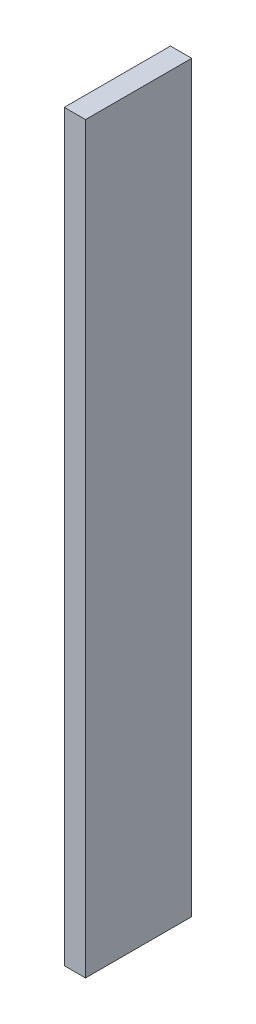
ISO-10303-21;
HEADER;
FILE_DESCRIPTION(('STEP AP214'),'2;1');
FILE_NAME('part.step','',(''),(''),'','','');
FILE_SCHEMA(('AUTOMOTIVE_DESIGN { 1 0 10303 214 1 1 1 1 }'));
ENDSEC;
DATA;
#1=APPLICATION_CONTEXT('core data for automotive mechanical design processes');
#2=APPLICATION_PROTOCOL_DEFINITION('international standard','automotive_design',2000,#1);
#3=PRODUCT_CONTEXT('',#1,'mechanical');
#4=PRODUCT('Part','Part','',(#3));
#5=PRODUCT_RELATED_PRODUCT_CATEGORY('part','',(#4));
#6=PRODUCT_DEFINITION_FORMATION('','',#4);
#7=PRODUCT_DEFINITION_CONTEXT('part definition',#1,'design');
#8=PRODUCT_DEFINITION('design','',#6,#7);
#9=PRODUCT_DEFINITION_SHAPE('','',#8);
#10=(LENGTH_UNIT() NAMED_UNIT(*) SI_UNIT(.MILLI.,.METRE.));
#11=(NAMED_UNIT(*) PLANE_ANGLE_UNIT() SI_UNIT($,.RADIAN.));
#12=(NAMED_UNIT(*) SI_UNIT($,.STERADIAN.) SOLID_ANGLE_UNIT());
#13=UNCERTAINTY_MEASURE_WITH_UNIT(LENGTH_MEASURE(1.E-05),#10,'distance_accuracy_value','');
#14=(GEOMETRIC_REPRESENTATION_CONTEXT(3) GLOBAL_UNCERTAINTY_ASSIGNED_CONTEXT((#13)) GLOBAL_UNIT_ASSIGNED_CONTEXT((#10,
#11,#12)) REPRESENTATION_CONTEXT('',''));
#15=CARTESIAN_POINT('',(0.,0.,0.));
#16=DIRECTION('',(0.,0.,1.));
#17=DIRECTION('',(1.,0.,0.));
#18=AXIS2_PLACEMENT_3D('',#15,#16,#17);
#19=CARTESIAN_POINT('',(0.,0.,50.));
#20=DIRECTION('',(1.,0.,0.));
#21=DIRECTION('',(0.,0.,-1.));
#22=AXIS2_PLACEMENT_3D('',#19,#20,#21);
#23=PLANE('',#22);
#24=DIRECTION('',(0.,-1.,0.));
#25=VECTOR('',#24,1.);
#26=CARTESIAN_POINT('',(0.,0.,0.));
#27=LINE('',#26,#25);
#28=CARTESIAN_POINT('',(0.,350.,0.));
#29=VERTEX_POINT('',#28);
#30=CARTESIAN_POINT('',(0.,0.,0.));
#31=VERTEX_POINT('',#30);
#32=EDGE_CURVE('E102',#29,#31,#27,.T.);
#33=ORIENTED_EDGE('',*,*,#32,.T.);
#34=DIRECTION('',(0.,0.,-1.));
#35=VECTOR('',#34,1.);
#36=CARTESIAN_POINT('',(0.,0.,50.));
#37=LINE('',#36,#35);
#38=CARTESIAN_POINT('',(0.,0.,50.));
#39=VERTEX_POINT('',#38);
#40=EDGE_CURVE('E11',#39,#31,#37,.T.);
#41=ORIENTED_EDGE('',*,*,#40,.F.);
#42=DIRECTION('',(0.,-1.,0.));
#43=VECTOR('',#42,1.);
#44=CARTESIAN_POINT('',(0.,0.,50.));
#45=LINE('',#44,#43);
#46=CARTESIAN_POINT('',(0.,350.,50.));
#47=VERTEX_POINT('',#46);
#48=EDGE_CURVE('E90',#47,#39,#45,.T.);
#49=ORIENTED_EDGE('',*,*,#48,.F.);
#50=DIRECTION('',(0.,0.,-1.));
#51=VECTOR('',#50,1.);
#52=CARTESIAN_POINT('',(0.,350.,50.));
#53=LINE('',#52,#51);
#54=EDGE_CURVE('E98',#47,#29,#53,.T.);
#55=ORIENTED_EDGE('',*,*,#54,.T.);
#56=EDGE_LOOP('',(#33,#41,#49,#55));
#57=FACE_BOUND('',#56,.T.);
#58=ADVANCED_FACE('F39',(#57),#23,.F.);
#59=CARTESIAN_POINT('',(0.,0.,50.));
#60=DIRECTION('',(0.,1.,0.));
#61=DIRECTION('',(0.,0.,1.));
#62=AXIS2_PLACEMENT_3D('',#59,#60,#61);
#63=PLANE('',#62);
#64=DIRECTION('',(1.,0.,0.));
#65=VECTOR('',#64,1.);
#66=CARTESIAN_POINT('',(0.,0.,0.));
#67=LINE('',#66,#65);
#68=CARTESIAN_POINT('',(10.,0.,0.));
#69=VERTEX_POINT('',#68);
#70=EDGE_CURVE('E94',#31,#69,#67,.T.);
#71=ORIENTED_EDGE('',*,*,#70,.T.);
#72=DIRECTION('',(0.,0.,-1.));
#73=VECTOR('',#72,1.);
#74=CARTESIAN_POINT('',(10.,0.,50.));
#75=LINE('',#74,#73);
#76=CARTESIAN_POINT('',(10.,0.,50.));
#77=VERTEX_POINT('',#76);
#78=EDGE_CURVE('E47',#77,#69,#75,.T.);
#79=ORIENTED_EDGE('',*,*,#78,.F.);
#80=DIRECTION('',(1.,0.,0.));
#81=VECTOR('',#80,1.);
#82=CARTESIAN_POINT('',(0.,0.,50.));
#83=LINE('',#82,#81);
#84=EDGE_CURVE('E85',#39,#77,#83,.T.);
#85=ORIENTED_EDGE('',*,*,#84,.F.);
#86=ORIENTED_EDGE('',*,*,#40,.T.);
#87=EDGE_LOOP('',(#71,#79,#85,#86));
#88=FACE_BOUND('',#87,.T.);
#89=ADVANCED_FACE('F93',(#88),#63,.F.);
#90=CARTESIAN_POINT('',(10.,0.,50.));
#91=DIRECTION('',(-1.,0.,0.));
#92=DIRECTION('',(0.,-1.,0.));
#93=AXIS2_PLACEMENT_3D('',#90,#91,#92);
#94=PLANE('',#93);
#95=DIRECTION('',(0.,1.,0.));
#96=VECTOR('',#95,1.);
#97=CARTESIAN_POINT('',(10.,0.,0.));
#98=LINE('',#97,#96);
#99=CARTESIAN_POINT('',(10.,350.,0.));
#100=VERTEX_POINT('',#99);
#101=EDGE_CURVE('E72',#69,#100,#98,.T.);
#102=ORIENTED_EDGE('',*,*,#101,.T.);
#103=DIRECTION('',(0.,0.,-1.));
#104=VECTOR('',#103,1.);
#105=CARTESIAN_POINT('',(10.,350.,50.));
#106=LINE('',#105,#104);
#107=CARTESIAN_POINT('',(10.,350.,50.));
#108=VERTEX_POINT('',#107);
#109=EDGE_CURVE('E95',#108,#100,#106,.T.);
#110=ORIENTED_EDGE('',*,*,#109,.F.);
#111=DIRECTION('',(0.,1.,0.));
#112=VECTOR('',#111,1.);
#113=CARTESIAN_POINT('',(10.,0.,50.));
#114=LINE('',#113,#112);
#115=EDGE_CURVE('E88',#77,#108,#114,.T.);
#116=ORIENTED_EDGE('',*,*,#115,.F.);
#117=ORIENTED_EDGE('',*,*,#78,.T.);
#118=EDGE_LOOP('',(#102,#110,#116,#117));
#119=FACE_BOUND('',#118,.T.);
#120=ADVANCED_FACE('F96',(#119),#94,.F.);
#121=CARTESIAN_POINT('',(0.,350.,50.));
#122=DIRECTION('',(0.,-1.,0.));
#123=DIRECTION('',(0.,0.,-1.));
#124=AXIS2_PLACEMENT_3D('',#121,#122,#123);
#125=PLANE('',#124);
#126=DIRECTION('',(-1.,0.,0.));
#127=VECTOR('',#126,1.);
#128=CARTESIAN_POINT('',(0.,350.,0.));
#129=LINE('',#128,#127);
#130=EDGE_CURVE('E78',#100,#29,#129,.T.);
#131=ORIENTED_EDGE('',*,*,#130,.T.);
#132=ORIENTED_EDGE('',*,*,#54,.F.);
#133=DIRECTION('',(-1.,0.,0.));
#134=VECTOR('',#133,1.);
#135=CARTESIAN_POINT('',(0.,350.,50.));
#136=LINE('',#135,#134);
#137=EDGE_CURVE('E55',#108,#47,#136,.T.);
#138=ORIENTED_EDGE('',*,*,#137,.F.);
#139=ORIENTED_EDGE('',*,*,#109,.T.);
#140=EDGE_LOOP('',(#131,#132,#138,#139));
#141=FACE_BOUND('',#140,.T.);
#142=ADVANCED_FACE('F110',(#141),#125,.F.);
#143=CARTESIAN_POINT('',(0.,0.,50.));
#144=DIRECTION('',(0.,0.,-1.));
#145=DIRECTION('',(-1.,0.,0.));
#146=AXIS2_PLACEMENT_3D('',#143,#144,#145);
#147=PLANE('',#146);
#148=ORIENTED_EDGE('',*,*,#48,.T.);
#149=ORIENTED_EDGE('',*,*,#84,.T.);
#150=ORIENTED_EDGE('',*,*,#115,.T.);
#151=ORIENTED_EDGE('',*,*,#137,.T.);
#152=EDGE_LOOP('',(#148,#149,#150,#151));
#153=FACE_BOUND('',#152,.T.);
#154=ADVANCED_FACE('F86',(#153),#147,.F.);
#155=CARTESIAN_POINT('',(0.,0.,0.));
#156=DIRECTION('',(0.,0.,-1.));
#157=DIRECTION('',(-1.,0.,0.));
#158=AXIS2_PLACEMENT_3D('',#155,#156,#157);
#159=PLANE('',#158);
#160=CARTESIAN_POINT('',(5.00000000000001,330.,0.));
#161=DIRECTION('',(0.,0.,-1.));
#162=DIRECTION('',(-1.,0.,0.));
#163=AXIS2_PLACEMENT_3D('',#160,#161,#162);
#164=CIRCLE('',#163,1.4);
#165=CARTESIAN_POINT('',(3.6,330.,0.));
#166=VERTEX_POINT('',#165);
#167=EDGE_CURVE('E122',#166,#166,#164,.T.);
#168=ORIENTED_EDGE('',*,*,#167,.F.);
#169=EDGE_LOOP('',(#168));
#170=FACE_BOUND('',#169,.T.);
#171=CARTESIAN_POINT('',(5.00000000000001,20.,0.));
#172=DIRECTION('',(0.,0.,-1.));
#173=DIRECTION('',(-1.,0.,0.));
#174=AXIS2_PLACEMENT_3D('',#171,#172,#173);
#175=CIRCLE('',#174,1.4);
#176=CARTESIAN_POINT('',(3.60000000000001,20.,0.));
#177=VERTEX_POINT('',#176);
#178=EDGE_CURVE('E119',#177,#177,#175,.T.);
#179=ORIENTED_EDGE('',*,*,#178,.F.);
#180=EDGE_LOOP('',(#179));
#181=FACE_BOUND('',#180,.T.);
#182=ORIENTED_EDGE('',*,*,#32,.F.);
#183=ORIENTED_EDGE('',*,*,#130,.F.);
#184=ORIENTED_EDGE('',*,*,#101,.F.);
#185=ORIENTED_EDGE('',*,*,#70,.F.);
#186=EDGE_LOOP('',(#182,#183,#184,#185));
#187=FACE_BOUND('',#186,.T.);
#188=ADVANCED_FACE('F113',(#170,#181,#187),#159,.T.);
#189=CARTESIAN_POINT('',(5.00000000000001,20.,10.));
#190=DIRECTION('',(0.,0.,-1.));
#191=DIRECTION('',(-1.,0.,0.));
#192=AXIS2_PLACEMENT_3D('',#189,#190,#191);
#193=CYLINDRICAL_SURFACE('',#192,1.4);
#194=CARTESIAN_POINT('',(5.00000000000001,20.,10.));
#195=DIRECTION('',(0.,0.,-1.));
#196=DIRECTION('',(-1.,0.,0.));
#197=AXIS2_PLACEMENT_3D('',#194,#195,#196);
#198=CIRCLE('',#197,1.4);
#199=CARTESIAN_POINT('',(3.60000000000001,20.,10.));
#200=VERTEX_POINT('',#199);
#201=EDGE_CURVE('E116',#200,#200,#198,.T.);
#202=ORIENTED_EDGE('',*,*,#201,.F.);
#203=EDGE_LOOP('',(#202));
#204=FACE_BOUND('',#203,.T.);
#205=ORIENTED_EDGE('',*,*,#178,.T.);
#206=EDGE_LOOP('',(#205));
#207=FACE_BOUND('',#206,.T.);
#208=ADVANCED_FACE('F139',(#204,#207),#193,.F.);
#209=CARTESIAN_POINT('',(5.00000000000001,20.,10.));
#210=DIRECTION('',(0.,0.,-1.));
#211=DIRECTION('',(-1.,0.,0.));
#212=AXIS2_PLACEMENT_3D('',#209,#210,#211);
#213=PLANE('',#212);
#214=ORIENTED_EDGE('',*,*,#201,.T.);
#215=EDGE_LOOP('',(#214));
#216=FACE_BOUND('',#215,.T.);
#217=ADVANCED_FACE('F133',(#216),#213,.T.);
#218=CARTESIAN_POINT('',(5.00000000000001,330.,10.));
#219=DIRECTION('',(0.,0.,-1.));
#220=DIRECTION('',(-1.,0.,0.));
#221=AXIS2_PLACEMENT_3D('',#218,#219,#220);
#222=CYLINDRICAL_SURFACE('',#221,1.4);
#223=CARTESIAN_POINT('',(5.00000000000001,330.,10.));
#224=DIRECTION('',(0.,0.,-1.));
#225=DIRECTION('',(-1.,0.,0.));
#226=AXIS2_PLACEMENT_3D('',#223,#224,#225);
#227=CIRCLE('',#226,1.4);
#228=CARTESIAN_POINT('',(3.6,330.,10.));
#229=VERTEX_POINT('',#228);
#230=EDGE_CURVE('E105',#229,#229,#227,.T.);
#231=ORIENTED_EDGE('',*,*,#230,.F.);
#232=EDGE_LOOP('',(#231));
#233=FACE_BOUND('',#232,.T.);
#234=ORIENTED_EDGE('',*,*,#167,.T.);
#235=EDGE_LOOP('',(#234));
#236=FACE_BOUND('',#235,.T.);
#237=ADVANCED_FACE('F130',(#233,#236),#222,.F.);
#238=CARTESIAN_POINT('',(5.00000000000001,330.,10.));
#239=DIRECTION('',(0.,0.,-1.));
#240=DIRECTION('',(-1.,0.,0.));
#241=AXIS2_PLACEMENT_3D('',#238,#239,#240);
#242=PLANE('',#241);
#243=ORIENTED_EDGE('',*,*,#230,.T.);
#244=EDGE_LOOP('',(#243));
#245=FACE_BOUND('',#244,.T.);
#246=ADVANCED_FACE('F128',(#245),#242,.T.);
#247=CLOSED_SHELL('',(#58,#89,#120,#142,#154,#188,#208,#217,#237,#246));
#248=MANIFOLD_SOLID_BREP('B2',#247);
#249=ADVANCED_BREP_SHAPE_REPRESENTATION('',(#18,#248),#14);
#250=SHAPE_DEFINITION_REPRESENTATION(#9,#249);
ENDSEC;
END-ISO-10303-21;
